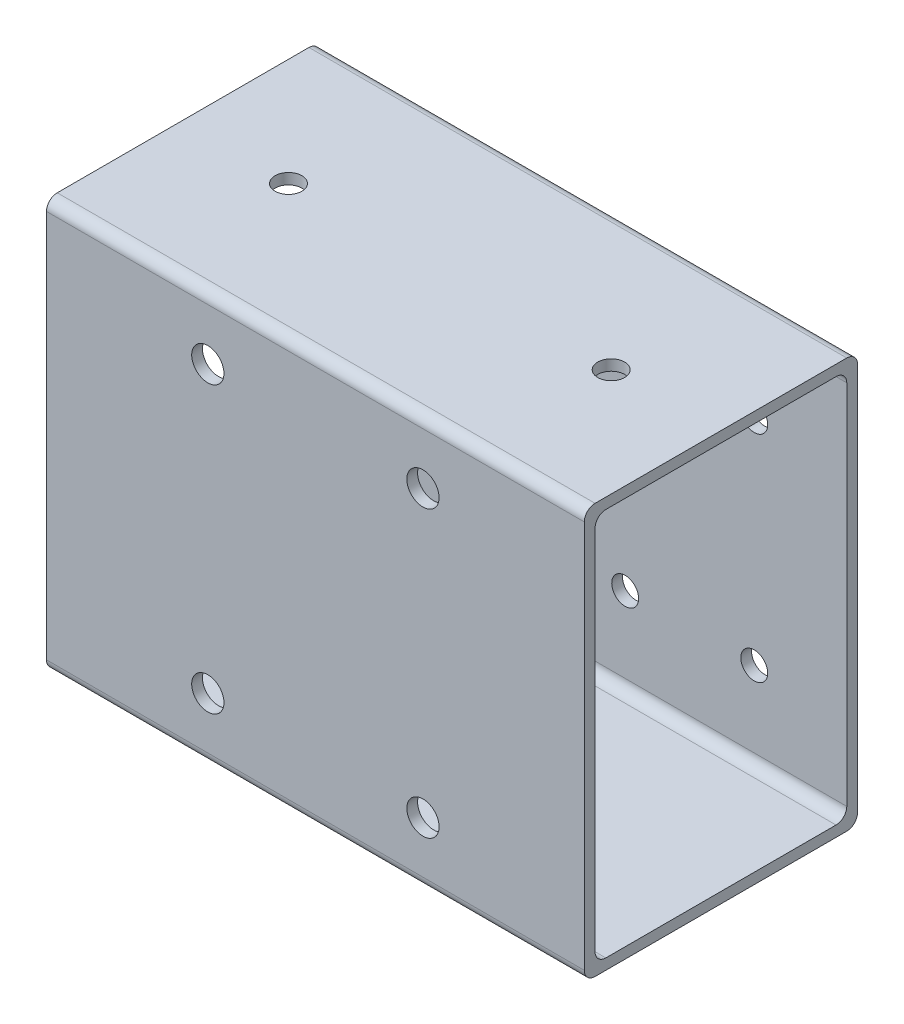
ISO-10303-21;
HEADER;
FILE_DESCRIPTION(('STEP AP214'),'2;1');
FILE_NAME('part.step','',(''),(''),'','','');
FILE_SCHEMA(('AUTOMOTIVE_DESIGN { 1 0 10303 214 1 1 1 1 }'));
ENDSEC;
DATA;
#1=APPLICATION_CONTEXT('core data for automotive mechanical design processes');
#2=APPLICATION_PROTOCOL_DEFINITION('international standard','automotive_design',2000,#1);
#3=PRODUCT_CONTEXT('',#1,'mechanical');
#4=PRODUCT('Part','Part','',(#3));
#5=PRODUCT_RELATED_PRODUCT_CATEGORY('part','',(#4));
#6=PRODUCT_DEFINITION_FORMATION('','',#4);
#7=PRODUCT_DEFINITION_CONTEXT('part definition',#1,'design');
#8=PRODUCT_DEFINITION('design','',#6,#7);
#9=PRODUCT_DEFINITION_SHAPE('','',#8);
#10=(LENGTH_UNIT() NAMED_UNIT(*) SI_UNIT(.MILLI.,.METRE.));
#11=(NAMED_UNIT(*) PLANE_ANGLE_UNIT() SI_UNIT($,.RADIAN.));
#12=(NAMED_UNIT(*) SI_UNIT($,.STERADIAN.) SOLID_ANGLE_UNIT());
#13=UNCERTAINTY_MEASURE_WITH_UNIT(LENGTH_MEASURE(1.E-05),#10,'distance_accuracy_value','');
#14=(GEOMETRIC_REPRESENTATION_CONTEXT(3) GLOBAL_UNCERTAINTY_ASSIGNED_CONTEXT((#13)) GLOBAL_UNIT_ASSIGNED_CONTEXT((#10,
#11,#12)) REPRESENTATION_CONTEXT('',''));
#15=CARTESIAN_POINT('',(0.,0.,0.));
#16=DIRECTION('',(0.,0.,1.));
#17=DIRECTION('',(1.,0.,0.));
#18=AXIS2_PLACEMENT_3D('',#15,#16,#17);
#19=CARTESIAN_POINT('',(-100.,38.1,25.4));
#20=DIRECTION('',(0.,0.,1.));
#21=DIRECTION('',(0.,-1.,0.));
#22=AXIS2_PLACEMENT_3D('',#19,#20,#21);
#23=PLANE('',#22);
#24=CARTESIAN_POINT('',(-30.,-26.5,25.4));
#25=DIRECTION('',(0.,0.,1.));
#26=DIRECTION('',(1.,0.,0.));
#27=AXIS2_PLACEMENT_3D('',#24,#25,#26);
#28=CIRCLE('',#27,3.);
#29=CARTESIAN_POINT('',(-27.,-26.5,25.4));
#30=VERTEX_POINT('',#29);
#31=EDGE_CURVE('E324',#30,#30,#28,.T.);
#32=ORIENTED_EDGE('',*,*,#31,.F.);
#33=EDGE_LOOP('',(#32));
#34=FACE_BOUND('',#33,.T.);
#35=CARTESIAN_POINT('',(-70.,-26.5,25.4));
#36=DIRECTION('',(0.,0.,1.));
#37=DIRECTION('',(1.,0.,0.));
#38=AXIS2_PLACEMENT_3D('',#35,#36,#37);
#39=CIRCLE('',#38,3.00000000000001);
#40=CARTESIAN_POINT('',(-67.,-26.5,25.4));
#41=VERTEX_POINT('',#40);
#42=EDGE_CURVE('E397',#41,#41,#39,.T.);
#43=ORIENTED_EDGE('',*,*,#42,.F.);
#44=EDGE_LOOP('',(#43));
#45=FACE_BOUND('',#44,.T.);
#46=CARTESIAN_POINT('',(-70.,26.5,25.4));
#47=DIRECTION('',(0.,0.,1.));
#48=DIRECTION('',(1.,0.,0.));
#49=AXIS2_PLACEMENT_3D('',#46,#47,#48);
#50=CIRCLE('',#49,3.00000000000001);
#51=CARTESIAN_POINT('',(-67.,26.5,25.4));
#52=VERTEX_POINT('',#51);
#53=EDGE_CURVE('E393',#52,#52,#50,.T.);
#54=ORIENTED_EDGE('',*,*,#53,.F.);
#55=EDGE_LOOP('',(#54));
#56=FACE_BOUND('',#55,.T.);
#57=CARTESIAN_POINT('',(-30.,26.5,25.4));
#58=DIRECTION('',(0.,0.,1.));
#59=DIRECTION('',(1.,0.,0.));
#60=AXIS2_PLACEMENT_3D('',#57,#58,#59);
#61=CIRCLE('',#60,3.);
#62=CARTESIAN_POINT('',(-27.,26.5,25.4));
#63=VERTEX_POINT('',#62);
#64=EDGE_CURVE('E290',#63,#63,#61,.T.);
#65=ORIENTED_EDGE('',*,*,#64,.F.);
#66=EDGE_LOOP('',(#65));
#67=FACE_BOUND('',#66,.T.);
#68=DIRECTION('',(0.,-1.,0.));
#69=VECTOR('',#68,1.);
#70=CARTESIAN_POINT('',(-100.,38.1,25.4));
#71=LINE('',#70,#69);
#72=CARTESIAN_POINT('',(-100.,36.1,25.4));
#73=VERTEX_POINT('',#72);
#74=CARTESIAN_POINT('',(-100.,-36.0999999999999,25.4));
#75=VERTEX_POINT('',#74);
#76=EDGE_CURVE('E438',#73,#75,#71,.T.);
#77=ORIENTED_EDGE('',*,*,#76,.T.);
#78=DIRECTION('',(1.,0.,0.));
#79=VECTOR('',#78,1.);
#80=CARTESIAN_POINT('',(-100.,-36.1,25.4));
#81=LINE('',#80,#79);
#82=CARTESIAN_POINT('',(0.,-36.0999999999999,25.4));
#83=VERTEX_POINT('',#82);
#84=EDGE_CURVE('E228',#75,#83,#81,.T.);
#85=ORIENTED_EDGE('',*,*,#84,.T.);
#86=DIRECTION('',(0.,-1.,0.));
#87=VECTOR('',#86,1.);
#88=CARTESIAN_POINT('',(0.,38.1,25.4));
#89=LINE('',#88,#87);
#90=CARTESIAN_POINT('',(0.,36.1,25.4));
#91=VERTEX_POINT('',#90);
#92=EDGE_CURVE('E166',#91,#83,#89,.T.);
#93=ORIENTED_EDGE('',*,*,#92,.F.);
#94=DIRECTION('',(1.,0.,0.));
#95=VECTOR('',#94,1.);
#96=CARTESIAN_POINT('',(-100.,36.1,25.4));
#97=LINE('',#96,#95);
#98=EDGE_CURVE('E225',#91,#73,#97,.F.);
#99=ORIENTED_EDGE('',*,*,#98,.T.);
#100=EDGE_LOOP('',(#77,#85,#93,#99));
#101=FACE_BOUND('',#100,.T.);
#102=ADVANCED_FACE('F44',(#34,#45,#56,#67,#101),#23,.T.);
#103=CARTESIAN_POINT('',(-100.,38.1,-25.4));
#104=DIRECTION('',(0.,1.,0.));
#105=DIRECTION('',(0.,0.,1.));
#106=AXIS2_PLACEMENT_3D('',#103,#104,#105);
#107=PLANE('',#106);
#108=CARTESIAN_POINT('',(-80.,38.1,0.400000000000013));
#109=DIRECTION('',(0.,1.,0.));
#110=DIRECTION('',(0.,0.,1.));
#111=AXIS2_PLACEMENT_3D('',#108,#109,#110);
#112=CIRCLE('',#111,2.50000000000001);
#113=CARTESIAN_POINT('',(-80.,38.1,2.90000000000002));
#114=VERTEX_POINT('',#113);
#115=EDGE_CURVE('E345',#114,#114,#112,.T.);
#116=ORIENTED_EDGE('',*,*,#115,.F.);
#117=EDGE_LOOP('',(#116));
#118=FACE_BOUND('',#117,.T.);
#119=CARTESIAN_POINT('',(-20.,38.1,0.400000000000013));
#120=DIRECTION('',(0.,1.,0.));
#121=DIRECTION('',(0.,0.,1.));
#122=AXIS2_PLACEMENT_3D('',#119,#120,#121);
#123=CIRCLE('',#122,2.5);
#124=CARTESIAN_POINT('',(-20.,38.1,2.90000000000001));
#125=VERTEX_POINT('',#124);
#126=EDGE_CURVE('E353',#125,#125,#123,.T.);
#127=ORIENTED_EDGE('',*,*,#126,.F.);
#128=EDGE_LOOP('',(#127));
#129=FACE_BOUND('',#128,.T.);
#130=DIRECTION('',(0.,0.,1.));
#131=VECTOR('',#130,1.);
#132=CARTESIAN_POINT('',(-100.,38.1,-25.4));
#133=LINE('',#132,#131);
#134=CARTESIAN_POINT('',(-100.,38.1,-23.4));
#135=VERTEX_POINT('',#134);
#136=CARTESIAN_POINT('',(-100.,38.1,23.4));
#137=VERTEX_POINT('',#136);
#138=EDGE_CURVE('E190',#135,#137,#133,.T.);
#139=ORIENTED_EDGE('',*,*,#138,.T.);
#140=DIRECTION('',(1.,0.,0.));
#141=VECTOR('',#140,1.);
#142=CARTESIAN_POINT('',(-100.,38.1,23.4));
#143=LINE('',#142,#141);
#144=CARTESIAN_POINT('',(0.,38.1,23.4));
#145=VERTEX_POINT('',#144);
#146=EDGE_CURVE('E233',#137,#145,#143,.T.);
#147=ORIENTED_EDGE('',*,*,#146,.T.);
#148=DIRECTION('',(0.,0.,1.));
#149=VECTOR('',#148,1.);
#150=CARTESIAN_POINT('',(0.,38.1,-25.4));
#151=LINE('',#150,#149);
#152=CARTESIAN_POINT('',(0.,38.1,-23.4));
#153=VERTEX_POINT('',#152);
#154=EDGE_CURVE('E199',#153,#145,#151,.T.);
#155=ORIENTED_EDGE('',*,*,#154,.F.);
#156=DIRECTION('',(1.,0.,0.));
#157=VECTOR('',#156,1.);
#158=CARTESIAN_POINT('',(-100.,38.1,-23.4));
#159=LINE('',#158,#157);
#160=EDGE_CURVE('E69',#153,#135,#159,.F.);
#161=ORIENTED_EDGE('',*,*,#160,.T.);
#162=EDGE_LOOP('',(#139,#147,#155,#161));
#163=FACE_BOUND('',#162,.T.);
#164=ADVANCED_FACE('F454',(#118,#129,#163),#107,.T.);
#165=CARTESIAN_POINT('',(-100.,38.1,-25.4));
#166=DIRECTION('',(0.,0.,-1.));
#167=DIRECTION('',(0.,1.,0.));
#168=AXIS2_PLACEMENT_3D('',#165,#166,#167);
#169=PLANE('',#168);
#170=CARTESIAN_POINT('',(-17.2,-20.,-25.4));
#171=DIRECTION('',(0.,0.,-1.));
#172=DIRECTION('',(0.,1.,0.));
#173=AXIS2_PLACEMENT_3D('',#170,#171,#172);
#174=CIRCLE('',#173,2.5);
#175=CARTESIAN_POINT('',(-17.2,-17.5,-25.4));
#176=VERTEX_POINT('',#175);
#177=EDGE_CURVE('E351',#176,#176,#174,.T.);
#178=ORIENTED_EDGE('',*,*,#177,.F.);
#179=EDGE_LOOP('',(#178));
#180=FACE_BOUND('',#179,.T.);
#181=CARTESIAN_POINT('',(-41.2,-20.,-25.4));
#182=DIRECTION('',(0.,0.,-1.));
#183=DIRECTION('',(0.,1.,0.));
#184=AXIS2_PLACEMENT_3D('',#181,#182,#183);
#185=CIRCLE('',#184,2.5);
#186=CARTESIAN_POINT('',(-41.2,-17.5,-25.4));
#187=VERTEX_POINT('',#186);
#188=EDGE_CURVE('E365',#187,#187,#185,.T.);
#189=ORIENTED_EDGE('',*,*,#188,.F.);
#190=EDGE_LOOP('',(#189));
#191=FACE_BOUND('',#190,.T.);
#192=CARTESIAN_POINT('',(-41.2,20.,-25.4));
#193=DIRECTION('',(0.,0.,-1.));
#194=DIRECTION('',(0.,1.,0.));
#195=AXIS2_PLACEMENT_3D('',#192,#193,#194);
#196=CIRCLE('',#195,2.5);
#197=CARTESIAN_POINT('',(-41.2,22.5,-25.4));
#198=VERTEX_POINT('',#197);
#199=EDGE_CURVE('E361',#198,#198,#196,.T.);
#200=ORIENTED_EDGE('',*,*,#199,.F.);
#201=EDGE_LOOP('',(#200));
#202=FACE_BOUND('',#201,.T.);
#203=CARTESIAN_POINT('',(-17.2,20.,-25.4));
#204=DIRECTION('',(0.,0.,-1.));
#205=DIRECTION('',(0.,1.,0.));
#206=AXIS2_PLACEMENT_3D('',#203,#204,#205);
#207=CIRCLE('',#206,2.5);
#208=CARTESIAN_POINT('',(-17.2,22.5,-25.4));
#209=VERTEX_POINT('',#208);
#210=EDGE_CURVE('E330',#209,#209,#207,.T.);
#211=ORIENTED_EDGE('',*,*,#210,.F.);
#212=EDGE_LOOP('',(#211));
#213=FACE_BOUND('',#212,.T.);
#214=CARTESIAN_POINT('',(-74.6,0.,-25.4));
#215=DIRECTION('',(0.,0.,-1.));
#216=DIRECTION('',(0.,1.,0.));
#217=AXIS2_PLACEMENT_3D('',#214,#215,#216);
#218=CIRCLE('',#217,2.5);
#219=CARTESIAN_POINT('',(-74.6,2.49999999999999,-25.4));
#220=VERTEX_POINT('',#219);
#221=EDGE_CURVE('E341',#220,#220,#218,.T.);
#222=ORIENTED_EDGE('',*,*,#221,.F.);
#223=EDGE_LOOP('',(#222));
#224=FACE_BOUND('',#223,.T.);
#225=CARTESIAN_POINT('',(-90.,-23.1,-25.4));
#226=DIRECTION('',(0.,0.,-1.));
#227=DIRECTION('',(0.,1.,0.));
#228=AXIS2_PLACEMENT_3D('',#225,#226,#227);
#229=CIRCLE('',#228,2.50000000000001);
#230=CARTESIAN_POINT('',(-90.,-20.6,-25.4));
#231=VERTEX_POINT('',#230);
#232=EDGE_CURVE('E383',#231,#231,#229,.T.);
#233=ORIENTED_EDGE('',*,*,#232,.F.);
#234=EDGE_LOOP('',(#233));
#235=FACE_BOUND('',#234,.T.);
#236=CARTESIAN_POINT('',(-59.2,-23.1,-25.4));
#237=DIRECTION('',(0.,0.,-1.));
#238=DIRECTION('',(0.,1.,0.));
#239=AXIS2_PLACEMENT_3D('',#236,#237,#238);
#240=CIRCLE('',#239,2.5);
#241=CARTESIAN_POINT('',(-59.2,-20.6,-25.4));
#242=VERTEX_POINT('',#241);
#243=EDGE_CURVE('E379',#242,#242,#240,.T.);
#244=ORIENTED_EDGE('',*,*,#243,.F.);
#245=EDGE_LOOP('',(#244));
#246=FACE_BOUND('',#245,.T.);
#247=CARTESIAN_POINT('',(-59.2,23.1,-25.4));
#248=DIRECTION('',(0.,0.,-1.));
#249=DIRECTION('',(0.,1.,0.));
#250=AXIS2_PLACEMENT_3D('',#247,#248,#249);
#251=CIRCLE('',#250,2.5);
#252=CARTESIAN_POINT('',(-59.2,25.6,-25.4));
#253=VERTEX_POINT('',#252);
#254=EDGE_CURVE('E375',#253,#253,#251,.T.);
#255=ORIENTED_EDGE('',*,*,#254,.F.);
#256=EDGE_LOOP('',(#255));
#257=FACE_BOUND('',#256,.T.);
#258=CARTESIAN_POINT('',(-90.,23.1,-25.4));
#259=DIRECTION('',(0.,0.,-1.));
#260=DIRECTION('',(0.,1.,0.));
#261=AXIS2_PLACEMENT_3D('',#258,#259,#260);
#262=CIRCLE('',#261,2.5);
#263=CARTESIAN_POINT('',(-90.,25.6,-25.4));
#264=VERTEX_POINT('',#263);
#265=EDGE_CURVE('E308',#264,#264,#262,.T.);
#266=ORIENTED_EDGE('',*,*,#265,.F.);
#267=EDGE_LOOP('',(#266));
#268=FACE_BOUND('',#267,.T.);
#269=DIRECTION('',(0.,1.,0.));
#270=VECTOR('',#269,1.);
#271=CARTESIAN_POINT('',(0.,38.1,-25.4));
#272=LINE('',#271,#270);
#273=CARTESIAN_POINT('',(0.,-36.0999999999999,-25.4));
#274=VERTEX_POINT('',#273);
#275=CARTESIAN_POINT('',(0.,36.1,-25.4));
#276=VERTEX_POINT('',#275);
#277=EDGE_CURVE('E184',#274,#276,#272,.T.);
#278=ORIENTED_EDGE('',*,*,#277,.F.);
#279=DIRECTION('',(1.,0.,0.));
#280=VECTOR('',#279,1.);
#281=CARTESIAN_POINT('',(-100.,-36.1,-25.4));
#282=LINE('',#281,#280);
#283=CARTESIAN_POINT('',(-100.,-36.0999999999999,-25.4));
#284=VERTEX_POINT('',#283);
#285=EDGE_CURVE('E212',#274,#284,#282,.F.);
#286=ORIENTED_EDGE('',*,*,#285,.T.);
#287=DIRECTION('',(0.,1.,0.));
#288=VECTOR('',#287,1.);
#289=CARTESIAN_POINT('',(-100.,38.1,-25.4));
#290=LINE('',#289,#288);
#291=CARTESIAN_POINT('',(-100.,36.1,-25.4));
#292=VERTEX_POINT('',#291);
#293=EDGE_CURVE('E196',#284,#292,#290,.T.);
#294=ORIENTED_EDGE('',*,*,#293,.T.);
#295=DIRECTION('',(1.,0.,0.));
#296=VECTOR('',#295,1.);
#297=CARTESIAN_POINT('',(-100.,36.1,-25.4));
#298=LINE('',#297,#296);
#299=EDGE_CURVE('E208',#292,#276,#298,.T.);
#300=ORIENTED_EDGE('',*,*,#299,.T.);
#301=EDGE_LOOP('',(#278,#286,#294,#300));
#302=FACE_BOUND('',#301,.T.);
#303=ADVANCED_FACE('F464',(#180,#191,#202,#213,#224,#235,#246,#257,#268,#302),#169,.T.);
#304=CARTESIAN_POINT('',(-100.,-38.1,-25.4));
#305=DIRECTION('',(0.,-1.,0.));
#306=DIRECTION('',(0.,0.,-1.));
#307=AXIS2_PLACEMENT_3D('',#304,#305,#306);
#308=PLANE('',#307);
#309=DIRECTION('',(0.,0.,-1.));
#310=VECTOR('',#309,1.);
#311=CARTESIAN_POINT('',(-100.,-38.1,-25.4));
#312=LINE('',#311,#310);
#313=CARTESIAN_POINT('',(-100.,-38.1,23.4));
#314=VERTEX_POINT('',#313);
#315=CARTESIAN_POINT('',(-100.,-38.1,-23.4));
#316=VERTEX_POINT('',#315);
#317=EDGE_CURVE('E442',#314,#316,#312,.T.);
#318=ORIENTED_EDGE('',*,*,#317,.T.);
#319=DIRECTION('',(1.,0.,0.));
#320=VECTOR('',#319,1.);
#321=CARTESIAN_POINT('',(-100.,-38.1,-23.4));
#322=LINE('',#321,#320);
#323=CARTESIAN_POINT('',(0.,-38.1,-23.4));
#324=VERTEX_POINT('',#323);
#325=EDGE_CURVE('E182',#316,#324,#322,.T.);
#326=ORIENTED_EDGE('',*,*,#325,.T.);
#327=DIRECTION('',(0.,0.,-1.));
#328=VECTOR('',#327,1.);
#329=CARTESIAN_POINT('',(0.,-38.1,-25.4));
#330=LINE('',#329,#328);
#331=CARTESIAN_POINT('',(0.,-38.1,23.4));
#332=VERTEX_POINT('',#331);
#333=EDGE_CURVE('E164',#332,#324,#330,.T.);
#334=ORIENTED_EDGE('',*,*,#333,.F.);
#335=DIRECTION('',(1.,0.,0.));
#336=VECTOR('',#335,1.);
#337=CARTESIAN_POINT('',(-100.,-38.1,23.4));
#338=LINE('',#337,#336);
#339=EDGE_CURVE('E179',#332,#314,#338,.F.);
#340=ORIENTED_EDGE('',*,*,#339,.T.);
#341=EDGE_LOOP('',(#318,#326,#334,#340));
#342=FACE_BOUND('',#341,.T.);
#343=ADVANCED_FACE('F178',(#342),#308,.T.);
#344=CARTESIAN_POINT('',(-100.,0.,0.));
#345=DIRECTION('',(-1.,0.,0.));
#346=DIRECTION('',(0.,0.,1.));
#347=AXIS2_PLACEMENT_3D('',#344,#345,#346);
#348=PLANE('',#347);
#349=DIRECTION('',(0.,0.,1.));
#350=VECTOR('',#349,1.);
#351=CARTESIAN_POINT('',(-100.,36.1,-23.4));
#352=LINE('',#351,#350);
#353=CARTESIAN_POINT('',(-100.,36.1,-21.4));
#354=VERTEX_POINT('',#353);
#355=CARTESIAN_POINT('',(-100.,36.1,21.4));
#356=VERTEX_POINT('',#355);
#357=EDGE_CURVE('E420',#354,#356,#352,.T.);
#358=ORIENTED_EDGE('',*,*,#357,.T.);
#359=CARTESIAN_POINT('',(-100.,34.1,21.4));
#360=DIRECTION('',(-1.,0.,0.));
#361=DIRECTION('',(0.,0.,1.));
#362=AXIS2_PLACEMENT_3D('',#359,#360,#361);
#363=CIRCLE('',#362,2.);
#364=CARTESIAN_POINT('',(-100.,34.1,23.4));
#365=VERTEX_POINT('',#364);
#366=EDGE_CURVE('E11',#356,#365,#363,.F.);
#367=ORIENTED_EDGE('',*,*,#366,.T.);
#368=DIRECTION('',(0.,-1.,0.));
#369=VECTOR('',#368,1.);
#370=CARTESIAN_POINT('',(-100.,36.1,23.4));
#371=LINE('',#370,#369);
#372=CARTESIAN_POINT('',(-100.,-34.1,23.4));
#373=VERTEX_POINT('',#372);
#374=EDGE_CURVE('E407',#365,#373,#371,.T.);
#375=ORIENTED_EDGE('',*,*,#374,.T.);
#376=CARTESIAN_POINT('',(-100.,-34.1,21.4));
#377=DIRECTION('',(-1.,0.,0.));
#378=DIRECTION('',(0.,0.,1.));
#379=AXIS2_PLACEMENT_3D('',#376,#377,#378);
#380=CIRCLE('',#379,2.);
#381=CARTESIAN_POINT('',(-100.,-36.1,21.4));
#382=VERTEX_POINT('',#381);
#383=EDGE_CURVE('E280',#373,#382,#380,.F.);
#384=ORIENTED_EDGE('',*,*,#383,.T.);
#385=DIRECTION('',(0.,0.,-1.));
#386=VECTOR('',#385,1.);
#387=CARTESIAN_POINT('',(-100.,-36.1,-23.4));
#388=LINE('',#387,#386);
#389=CARTESIAN_POINT('',(-100.,-36.1,-21.4));
#390=VERTEX_POINT('',#389);
#391=EDGE_CURVE('E411',#382,#390,#388,.T.);
#392=ORIENTED_EDGE('',*,*,#391,.T.);
#393=CARTESIAN_POINT('',(-100.,-34.1,-21.4));
#394=DIRECTION('',(-1.,0.,0.));
#395=DIRECTION('',(0.,0.,1.));
#396=AXIS2_PLACEMENT_3D('',#393,#394,#395);
#397=CIRCLE('',#396,2.);
#398=CARTESIAN_POINT('',(-100.,-34.1,-23.4));
#399=VERTEX_POINT('',#398);
#400=EDGE_CURVE('E268',#390,#399,#397,.F.);
#401=ORIENTED_EDGE('',*,*,#400,.T.);
#402=DIRECTION('',(0.,1.,0.));
#403=VECTOR('',#402,1.);
#404=CARTESIAN_POINT('',(-100.,36.1,-23.4));
#405=LINE('',#404,#403);
#406=CARTESIAN_POINT('',(-100.,34.1,-23.4));
#407=VERTEX_POINT('',#406);
#408=EDGE_CURVE('E416',#399,#407,#405,.T.);
#409=ORIENTED_EDGE('',*,*,#408,.T.);
#410=CARTESIAN_POINT('',(-100.,34.1,-21.4));
#411=DIRECTION('',(-1.,0.,0.));
#412=DIRECTION('',(0.,0.,1.));
#413=AXIS2_PLACEMENT_3D('',#410,#411,#412);
#414=CIRCLE('',#413,2.);
#415=EDGE_CURVE('E274',#407,#354,#414,.F.);
#416=ORIENTED_EDGE('',*,*,#415,.T.);
#417=EDGE_LOOP('',(#358,#367,#375,#384,#392,#401,#409,#416));
#418=FACE_BOUND('',#417,.T.);
#419=ORIENTED_EDGE('',*,*,#293,.F.);
#420=CARTESIAN_POINT('',(-100.,-36.1,-23.4));
#421=DIRECTION('',(-1.,0.,0.));
#422=DIRECTION('',(0.,0.,1.));
#423=AXIS2_PLACEMENT_3D('',#420,#421,#422);
#424=CIRCLE('',#423,2.);
#425=EDGE_CURVE('E222',#284,#316,#424,.T.);
#426=ORIENTED_EDGE('',*,*,#425,.T.);
#427=ORIENTED_EDGE('',*,*,#317,.F.);
#428=CARTESIAN_POINT('',(-100.,-36.1,23.4));
#429=DIRECTION('',(-1.,0.,0.));
#430=DIRECTION('',(0.,0.,1.));
#431=AXIS2_PLACEMENT_3D('',#428,#429,#430);
#432=CIRCLE('',#431,2.);
#433=EDGE_CURVE('E188',#314,#75,#432,.T.);
#434=ORIENTED_EDGE('',*,*,#433,.T.);
#435=ORIENTED_EDGE('',*,*,#76,.F.);
#436=CARTESIAN_POINT('',(-100.,36.1,23.4));
#437=DIRECTION('',(-1.,0.,0.));
#438=DIRECTION('',(0.,0.,1.));
#439=AXIS2_PLACEMENT_3D('',#436,#437,#438);
#440=CIRCLE('',#439,2.);
#441=EDGE_CURVE('E62',#73,#137,#440,.T.);
#442=ORIENTED_EDGE('',*,*,#441,.T.);
#443=ORIENTED_EDGE('',*,*,#138,.F.);
#444=CARTESIAN_POINT('',(-100.,36.1,-23.4));
#445=DIRECTION('',(-1.,0.,0.));
#446=DIRECTION('',(0.,0.,1.));
#447=AXIS2_PLACEMENT_3D('',#444,#445,#446);
#448=CIRCLE('',#447,2.);
#449=EDGE_CURVE('E215',#135,#292,#448,.T.);
#450=ORIENTED_EDGE('',*,*,#449,.T.);
#451=EDGE_LOOP('',(#419,#426,#427,#434,#435,#442,#443,#450));
#452=FACE_BOUND('',#451,.T.);
#453=ADVANCED_FACE('F461',(#418,#452),#348,.T.);
#454=CARTESIAN_POINT('',(0.,0.,0.));
#455=DIRECTION('',(-1.,0.,0.));
#456=DIRECTION('',(0.,0.,1.));
#457=AXIS2_PLACEMENT_3D('',#454,#455,#456);
#458=PLANE('',#457);
#459=DIRECTION('',(0.,0.,-1.));
#460=VECTOR('',#459,1.);
#461=CARTESIAN_POINT('',(0.,-36.1,-23.4));
#462=LINE('',#461,#460);
#463=CARTESIAN_POINT('',(0.,-36.1,21.4));
#464=VERTEX_POINT('',#463);
#465=CARTESIAN_POINT('',(0.,-36.1,-21.4));
#466=VERTEX_POINT('',#465);
#467=EDGE_CURVE('E427',#464,#466,#462,.T.);
#468=ORIENTED_EDGE('',*,*,#467,.F.);
#469=CARTESIAN_POINT('',(0.,-34.1,21.4));
#470=DIRECTION('',(-1.,0.,0.));
#471=DIRECTION('',(0.,0.,1.));
#472=AXIS2_PLACEMENT_3D('',#469,#470,#471);
#473=CIRCLE('',#472,2.);
#474=CARTESIAN_POINT('',(0.,-34.1,23.4));
#475=VERTEX_POINT('',#474);
#476=EDGE_CURVE('E277',#464,#475,#473,.T.);
#477=ORIENTED_EDGE('',*,*,#476,.T.);
#478=DIRECTION('',(0.,-1.,0.));
#479=VECTOR('',#478,1.);
#480=CARTESIAN_POINT('',(0.,36.1,23.4));
#481=LINE('',#480,#479);
#482=CARTESIAN_POINT('',(0.,34.1,23.4));
#483=VERTEX_POINT('',#482);
#484=EDGE_CURVE('E302',#483,#475,#481,.T.);
#485=ORIENTED_EDGE('',*,*,#484,.F.);
#486=CARTESIAN_POINT('',(0.,34.1,21.4));
#487=DIRECTION('',(-1.,0.,0.));
#488=DIRECTION('',(0.,0.,1.));
#489=AXIS2_PLACEMENT_3D('',#486,#487,#488);
#490=CIRCLE('',#489,2.);
#491=CARTESIAN_POINT('',(0.,36.1,21.4));
#492=VERTEX_POINT('',#491);
#493=EDGE_CURVE('E54',#483,#492,#490,.T.);
#494=ORIENTED_EDGE('',*,*,#493,.T.);
#495=DIRECTION('',(0.,0.,1.));
#496=VECTOR('',#495,1.);
#497=CARTESIAN_POINT('',(0.,36.1,-23.4));
#498=LINE('',#497,#496);
#499=CARTESIAN_POINT('',(0.,36.1,-21.4));
#500=VERTEX_POINT('',#499);
#501=EDGE_CURVE('E412',#500,#492,#498,.T.);
#502=ORIENTED_EDGE('',*,*,#501,.F.);
#503=CARTESIAN_POINT('',(0.,34.1,-21.4));
#504=DIRECTION('',(-1.,0.,0.));
#505=DIRECTION('',(0.,0.,1.));
#506=AXIS2_PLACEMENT_3D('',#503,#504,#505);
#507=CIRCLE('',#506,2.);
#508=CARTESIAN_POINT('',(0.,34.1,-23.4));
#509=VERTEX_POINT('',#508);
#510=EDGE_CURVE('E271',#500,#509,#507,.T.);
#511=ORIENTED_EDGE('',*,*,#510,.T.);
#512=DIRECTION('',(0.,1.,0.));
#513=VECTOR('',#512,1.);
#514=CARTESIAN_POINT('',(0.,36.1,-23.4));
#515=LINE('',#514,#513);
#516=CARTESIAN_POINT('',(0.,-34.1,-23.4));
#517=VERTEX_POINT('',#516);
#518=EDGE_CURVE('E431',#517,#509,#515,.T.);
#519=ORIENTED_EDGE('',*,*,#518,.F.);
#520=CARTESIAN_POINT('',(0.,-34.1,-21.4));
#521=DIRECTION('',(-1.,0.,0.));
#522=DIRECTION('',(0.,0.,1.));
#523=AXIS2_PLACEMENT_3D('',#520,#521,#522);
#524=CIRCLE('',#523,2.);
#525=EDGE_CURVE('E265',#517,#466,#524,.T.);
#526=ORIENTED_EDGE('',*,*,#525,.T.);
#527=EDGE_LOOP('',(#468,#477,#485,#494,#502,#511,#519,#526));
#528=FACE_BOUND('',#527,.T.);
#529=ORIENTED_EDGE('',*,*,#333,.T.);
#530=CARTESIAN_POINT('',(0.,-36.1,-23.4));
#531=DIRECTION('',(-1.,0.,0.));
#532=DIRECTION('',(0.,0.,1.));
#533=AXIS2_PLACEMENT_3D('',#530,#531,#532);
#534=CIRCLE('',#533,2.);
#535=EDGE_CURVE('E172',#324,#274,#534,.F.);
#536=ORIENTED_EDGE('',*,*,#535,.T.);
#537=ORIENTED_EDGE('',*,*,#277,.T.);
#538=CARTESIAN_POINT('',(0.,36.1,-23.4));
#539=DIRECTION('',(-1.,0.,0.));
#540=DIRECTION('',(0.,0.,1.));
#541=AXIS2_PLACEMENT_3D('',#538,#539,#540);
#542=CIRCLE('',#541,2.);
#543=EDGE_CURVE('E194',#276,#153,#542,.F.);
#544=ORIENTED_EDGE('',*,*,#543,.T.);
#545=ORIENTED_EDGE('',*,*,#154,.T.);
#546=CARTESIAN_POINT('',(0.,36.1,23.4));
#547=DIRECTION('',(-1.,0.,0.));
#548=DIRECTION('',(0.,0.,1.));
#549=AXIS2_PLACEMENT_3D('',#546,#547,#548);
#550=CIRCLE('',#549,2.);
#551=EDGE_CURVE('E173',#145,#91,#550,.F.);
#552=ORIENTED_EDGE('',*,*,#551,.T.);
#553=ORIENTED_EDGE('',*,*,#92,.T.);
#554=CARTESIAN_POINT('',(0.,-36.1,23.4));
#555=DIRECTION('',(-1.,0.,0.));
#556=DIRECTION('',(0.,0.,1.));
#557=AXIS2_PLACEMENT_3D('',#554,#555,#556);
#558=CIRCLE('',#557,2.);
#559=EDGE_CURVE('E161',#83,#332,#558,.F.);
#560=ORIENTED_EDGE('',*,*,#559,.T.);
#561=EDGE_LOOP('',(#529,#536,#537,#544,#545,#552,#553,#560));
#562=FACE_BOUND('',#561,.T.);
#563=ADVANCED_FACE('F163',(#528,#562),#458,.F.);
#564=CARTESIAN_POINT('',(-100.,36.1,23.4));
#565=DIRECTION('',(0.,0.,1.));
#566=DIRECTION('',(1.,0.,0.));
#567=AXIS2_PLACEMENT_3D('',#564,#565,#566);
#568=PLANE('',#567);
#569=CARTESIAN_POINT('',(-30.,-26.5,23.4));
#570=DIRECTION('',(0.,0.,1.));
#571=DIRECTION('',(1.,0.,0.));
#572=AXIS2_PLACEMENT_3D('',#569,#570,#571);
#573=CIRCLE('',#572,3.);
#574=CARTESIAN_POINT('',(-27.,-26.5,23.4));
#575=VERTEX_POINT('',#574);
#576=EDGE_CURVE('E298',#575,#575,#573,.T.);
#577=ORIENTED_EDGE('',*,*,#576,.T.);
#578=EDGE_LOOP('',(#577));
#579=FACE_BOUND('',#578,.T.);
#580=CARTESIAN_POINT('',(-70.,-26.5,23.4));
#581=DIRECTION('',(0.,0.,1.));
#582=DIRECTION('',(1.,0.,0.));
#583=AXIS2_PLACEMENT_3D('',#580,#581,#582);
#584=CIRCLE('',#583,3.00000000000001);
#585=CARTESIAN_POINT('',(-67.,-26.5,23.4));
#586=VERTEX_POINT('',#585);
#587=EDGE_CURVE('E294',#586,#586,#584,.T.);
#588=ORIENTED_EDGE('',*,*,#587,.T.);
#589=EDGE_LOOP('',(#588));
#590=FACE_BOUND('',#589,.T.);
#591=CARTESIAN_POINT('',(-70.,26.5,23.4));
#592=DIRECTION('',(0.,0.,1.));
#593=DIRECTION('',(1.,0.,0.));
#594=AXIS2_PLACEMENT_3D('',#591,#592,#593);
#595=CIRCLE('',#594,3.00000000000001);
#596=CARTESIAN_POINT('',(-67.,26.5,23.4));
#597=VERTEX_POINT('',#596);
#598=EDGE_CURVE('E289',#597,#597,#595,.T.);
#599=ORIENTED_EDGE('',*,*,#598,.T.);
#600=EDGE_LOOP('',(#599));
#601=FACE_BOUND('',#600,.T.);
#602=CARTESIAN_POINT('',(-30.,26.5,23.4));
#603=DIRECTION('',(0.,0.,1.));
#604=DIRECTION('',(1.,0.,0.));
#605=AXIS2_PLACEMENT_3D('',#602,#603,#604);
#606=CIRCLE('',#605,3.);
#607=CARTESIAN_POINT('',(-27.,26.5,23.4));
#608=VERTEX_POINT('',#607);
#609=EDGE_CURVE('E285',#608,#608,#606,.T.);
#610=ORIENTED_EDGE('',*,*,#609,.T.);
#611=EDGE_LOOP('',(#610));
#612=FACE_BOUND('',#611,.T.);
#613=ORIENTED_EDGE('',*,*,#484,.T.);
#614=DIRECTION('',(1.,0.,0.));
#615=VECTOR('',#614,1.);
#616=CARTESIAN_POINT('',(-100.,-34.1,23.4));
#617=LINE('',#616,#615);
#618=EDGE_CURVE('E262',#475,#373,#617,.F.);
#619=ORIENTED_EDGE('',*,*,#618,.T.);
#620=ORIENTED_EDGE('',*,*,#374,.F.);
#621=DIRECTION('',(1.,0.,0.));
#622=VECTOR('',#621,1.);
#623=CARTESIAN_POINT('',(0.,34.1,23.4));
#624=LINE('',#623,#622);
#625=EDGE_CURVE('E258',#365,#483,#624,.T.);
#626=ORIENTED_EDGE('',*,*,#625,.T.);
#627=EDGE_LOOP('',(#613,#619,#620,#626));
#628=FACE_BOUND('',#627,.T.);
#629=ADVANCED_FACE('F510',(#579,#590,#601,#612,#628),#568,.F.);
#630=CARTESIAN_POINT('',(-100.,36.1,-23.4));
#631=DIRECTION('',(0.,1.,0.));
#632=DIRECTION('',(0.,0.,1.));
#633=AXIS2_PLACEMENT_3D('',#630,#631,#632);
#634=PLANE('',#633);
#635=CARTESIAN_POINT('',(-80.,36.1,0.400000000000013));
#636=DIRECTION('',(0.,1.,0.));
#637=DIRECTION('',(0.,0.,1.));
#638=AXIS2_PLACEMENT_3D('',#635,#636,#637);
#639=CIRCLE('',#638,2.50000000000001);
#640=CARTESIAN_POINT('',(-80.,36.1,2.90000000000002));
#641=VERTEX_POINT('',#640);
#642=EDGE_CURVE('E48',#641,#641,#639,.T.);
#643=ORIENTED_EDGE('',*,*,#642,.T.);
#644=EDGE_LOOP('',(#643));
#645=FACE_BOUND('',#644,.T.);
#646=CARTESIAN_POINT('',(-20.,36.1,0.400000000000013));
#647=DIRECTION('',(0.,1.,0.));
#648=DIRECTION('',(0.,0.,1.));
#649=AXIS2_PLACEMENT_3D('',#646,#647,#648);
#650=CIRCLE('',#649,2.5);
#651=CARTESIAN_POINT('',(-20.,36.1,2.90000000000001));
#652=VERTEX_POINT('',#651);
#653=EDGE_CURVE('E342',#652,#652,#650,.T.);
#654=ORIENTED_EDGE('',*,*,#653,.T.);
#655=EDGE_LOOP('',(#654));
#656=FACE_BOUND('',#655,.T.);
#657=ORIENTED_EDGE('',*,*,#357,.F.);
#658=DIRECTION('',(1.,0.,0.));
#659=VECTOR('',#658,1.);
#660=CARTESIAN_POINT('',(0.,36.1,-21.4));
#661=LINE('',#660,#659);
#662=EDGE_CURVE('E254',#354,#500,#661,.T.);
#663=ORIENTED_EDGE('',*,*,#662,.T.);
#664=ORIENTED_EDGE('',*,*,#501,.T.);
#665=DIRECTION('',(1.,0.,0.));
#666=VECTOR('',#665,1.);
#667=CARTESIAN_POINT('',(-100.,36.1,21.4));
#668=LINE('',#667,#666);
#669=EDGE_CURVE('E251',#492,#356,#668,.F.);
#670=ORIENTED_EDGE('',*,*,#669,.T.);
#671=EDGE_LOOP('',(#657,#663,#664,#670));
#672=FACE_BOUND('',#671,.T.);
#673=ADVANCED_FACE('F505',(#645,#656,#672),#634,.F.);
#674=CARTESIAN_POINT('',(-100.,36.1,-23.4));
#675=DIRECTION('',(0.,0.,-1.));
#676=DIRECTION('',(-1.,0.,0.));
#677=AXIS2_PLACEMENT_3D('',#674,#675,#676);
#678=PLANE('',#677);
#679=CARTESIAN_POINT('',(-17.2,-20.,-23.4));
#680=DIRECTION('',(0.,0.,-1.));
#681=DIRECTION('',(-1.,0.,0.));
#682=AXIS2_PLACEMENT_3D('',#679,#680,#681);
#683=CIRCLE('',#682,2.5);
#684=CARTESIAN_POINT('',(-19.7,-20.,-23.4));
#685=VERTEX_POINT('',#684);
#686=EDGE_CURVE('E338',#685,#685,#683,.T.);
#687=ORIENTED_EDGE('',*,*,#686,.T.);
#688=EDGE_LOOP('',(#687));
#689=FACE_BOUND('',#688,.T.);
#690=CARTESIAN_POINT('',(-41.2,-20.,-23.4));
#691=DIRECTION('',(0.,0.,-1.));
#692=DIRECTION('',(-1.,0.,0.));
#693=AXIS2_PLACEMENT_3D('',#690,#691,#692);
#694=CIRCLE('',#693,2.5);
#695=CARTESIAN_POINT('',(-43.7,-20.,-23.4));
#696=VERTEX_POINT('',#695);
#697=EDGE_CURVE('E334',#696,#696,#694,.T.);
#698=ORIENTED_EDGE('',*,*,#697,.T.);
#699=EDGE_LOOP('',(#698));
#700=FACE_BOUND('',#699,.T.);
#701=CARTESIAN_POINT('',(-41.2,20.,-23.4));
#702=DIRECTION('',(0.,0.,-1.));
#703=DIRECTION('',(-1.,0.,0.));
#704=AXIS2_PLACEMENT_3D('',#701,#702,#703);
#705=CIRCLE('',#704,2.5);
#706=CARTESIAN_POINT('',(-43.7,20.,-23.4));
#707=VERTEX_POINT('',#706);
#708=EDGE_CURVE('E329',#707,#707,#705,.T.);
#709=ORIENTED_EDGE('',*,*,#708,.T.);
#710=EDGE_LOOP('',(#709));
#711=FACE_BOUND('',#710,.T.);
#712=CARTESIAN_POINT('',(-17.2,20.,-23.4));
#713=DIRECTION('',(0.,0.,-1.));
#714=DIRECTION('',(-1.,0.,0.));
#715=AXIS2_PLACEMENT_3D('',#712,#713,#714);
#716=CIRCLE('',#715,2.5);
#717=CARTESIAN_POINT('',(-19.7,20.,-23.4));
#718=VERTEX_POINT('',#717);
#719=EDGE_CURVE('E325',#718,#718,#716,.T.);
#720=ORIENTED_EDGE('',*,*,#719,.T.);
#721=EDGE_LOOP('',(#720));
#722=FACE_BOUND('',#721,.T.);
#723=CARTESIAN_POINT('',(-74.6,0.,-23.4));
#724=DIRECTION('',(0.,0.,-1.));
#725=DIRECTION('',(-1.,0.,0.));
#726=AXIS2_PLACEMENT_3D('',#723,#724,#725);
#727=CIRCLE('',#726,2.5);
#728=CARTESIAN_POINT('',(-77.1,0.,-23.4));
#729=VERTEX_POINT('',#728);
#730=EDGE_CURVE('E320',#729,#729,#727,.T.);
#731=ORIENTED_EDGE('',*,*,#730,.T.);
#732=EDGE_LOOP('',(#731));
#733=FACE_BOUND('',#732,.T.);
#734=CARTESIAN_POINT('',(-90.,-23.1,-23.4));
#735=DIRECTION('',(0.,0.,-1.));
#736=DIRECTION('',(-1.,0.,0.));
#737=AXIS2_PLACEMENT_3D('',#734,#735,#736);
#738=CIRCLE('',#737,2.50000000000001);
#739=CARTESIAN_POINT('',(-92.5,-23.1,-23.4));
#740=VERTEX_POINT('',#739);
#741=EDGE_CURVE('E316',#740,#740,#738,.T.);
#742=ORIENTED_EDGE('',*,*,#741,.T.);
#743=EDGE_LOOP('',(#742));
#744=FACE_BOUND('',#743,.T.);
#745=CARTESIAN_POINT('',(-59.2,-23.1,-23.4));
#746=DIRECTION('',(0.,0.,-1.));
#747=DIRECTION('',(-1.,0.,0.));
#748=AXIS2_PLACEMENT_3D('',#745,#746,#747);
#749=CIRCLE('',#748,2.5);
#750=CARTESIAN_POINT('',(-61.7,-23.1,-23.4));
#751=VERTEX_POINT('',#750);
#752=EDGE_CURVE('E312',#751,#751,#749,.T.);
#753=ORIENTED_EDGE('',*,*,#752,.T.);
#754=EDGE_LOOP('',(#753));
#755=FACE_BOUND('',#754,.T.);
#756=CARTESIAN_POINT('',(-59.2,23.1,-23.4));
#757=DIRECTION('',(0.,0.,-1.));
#758=DIRECTION('',(-1.,0.,0.));
#759=AXIS2_PLACEMENT_3D('',#756,#757,#758);
#760=CIRCLE('',#759,2.5);
#761=CARTESIAN_POINT('',(-61.7,23.1,-23.4));
#762=VERTEX_POINT('',#761);
#763=EDGE_CURVE('E307',#762,#762,#760,.T.);
#764=ORIENTED_EDGE('',*,*,#763,.T.);
#765=EDGE_LOOP('',(#764));
#766=FACE_BOUND('',#765,.T.);
#767=CARTESIAN_POINT('',(-90.,23.1,-23.4));
#768=DIRECTION('',(0.,0.,-1.));
#769=DIRECTION('',(-1.,0.,0.));
#770=AXIS2_PLACEMENT_3D('',#767,#768,#769);
#771=CIRCLE('',#770,2.5);
#772=CARTESIAN_POINT('',(-92.5,23.1,-23.4));
#773=VERTEX_POINT('',#772);
#774=EDGE_CURVE('E303',#773,#773,#771,.T.);
#775=ORIENTED_EDGE('',*,*,#774,.T.);
#776=EDGE_LOOP('',(#775));
#777=FACE_BOUND('',#776,.T.);
#778=ORIENTED_EDGE('',*,*,#408,.F.);
#779=DIRECTION('',(1.,0.,0.));
#780=VECTOR('',#779,1.);
#781=CARTESIAN_POINT('',(0.,-34.1,-23.4));
#782=LINE('',#781,#780);
#783=EDGE_CURVE('E240',#399,#517,#782,.T.);
#784=ORIENTED_EDGE('',*,*,#783,.T.);
#785=ORIENTED_EDGE('',*,*,#518,.T.);
#786=DIRECTION('',(1.,0.,0.));
#787=VECTOR('',#786,1.);
#788=CARTESIAN_POINT('',(-100.,34.1,-23.4));
#789=LINE('',#788,#787);
#790=EDGE_CURVE('E237',#509,#407,#789,.F.);
#791=ORIENTED_EDGE('',*,*,#790,.T.);
#792=EDGE_LOOP('',(#778,#784,#785,#791));
#793=FACE_BOUND('',#792,.T.);
#794=ADVANCED_FACE('F499',(#689,#700,#711,#722,#733,#744,#755,#766,#777,#793),#678,.F.);
#795=CARTESIAN_POINT('',(-100.,-36.1,-23.4));
#796=DIRECTION('',(0.,-1.,0.));
#797=DIRECTION('',(0.,0.,-1.));
#798=AXIS2_PLACEMENT_3D('',#795,#796,#797);
#799=PLANE('',#798);
#800=ORIENTED_EDGE('',*,*,#467,.T.);
#801=DIRECTION('',(1.,0.,0.));
#802=VECTOR('',#801,1.);
#803=CARTESIAN_POINT('',(-100.,-36.1,-21.4));
#804=LINE('',#803,#802);
#805=EDGE_CURVE('E248',#466,#390,#804,.F.);
#806=ORIENTED_EDGE('',*,*,#805,.T.);
#807=ORIENTED_EDGE('',*,*,#391,.F.);
#808=DIRECTION('',(1.,0.,0.));
#809=VECTOR('',#808,1.);
#810=CARTESIAN_POINT('',(0.,-36.1,21.4));
#811=LINE('',#810,#809);
#812=EDGE_CURVE('E244',#382,#464,#811,.T.);
#813=ORIENTED_EDGE('',*,*,#812,.T.);
#814=EDGE_LOOP('',(#800,#806,#807,#813));
#815=FACE_BOUND('',#814,.T.);
#816=ADVANCED_FACE('F495',(#815),#799,.F.);
#817=CARTESIAN_POINT('',(-100.,-36.1,-23.4));
#818=DIRECTION('',(1.,0.,0.));
#819=DIRECTION('',(0.,0.,-1.));
#820=AXIS2_PLACEMENT_3D('',#817,#818,#819);
#821=CYLINDRICAL_SURFACE('',#820,2.);
#822=ORIENTED_EDGE('',*,*,#425,.F.);
#823=ORIENTED_EDGE('',*,*,#285,.F.);
#824=ORIENTED_EDGE('',*,*,#535,.F.);
#825=ORIENTED_EDGE('',*,*,#325,.F.);
#826=EDGE_LOOP('',(#822,#823,#824,#825));
#827=FACE_BOUND('',#826,.T.);
#828=ADVANCED_FACE('F467',(#827),#821,.T.);
#829=CARTESIAN_POINT('',(-100.,-36.1,23.4));
#830=DIRECTION('',(1.,0.,0.));
#831=DIRECTION('',(0.,0.,-1.));
#832=AXIS2_PLACEMENT_3D('',#829,#830,#831);
#833=CYLINDRICAL_SURFACE('',#832,2.);
#834=ORIENTED_EDGE('',*,*,#433,.F.);
#835=ORIENTED_EDGE('',*,*,#339,.F.);
#836=ORIENTED_EDGE('',*,*,#559,.F.);
#837=ORIENTED_EDGE('',*,*,#84,.F.);
#838=EDGE_LOOP('',(#834,#835,#836,#837));
#839=FACE_BOUND('',#838,.T.);
#840=ADVANCED_FACE('F187',(#839),#833,.T.);
#841=CARTESIAN_POINT('',(-100.,36.1,23.4));
#842=DIRECTION('',(1.,0.,0.));
#843=DIRECTION('',(0.,0.,-1.));
#844=AXIS2_PLACEMENT_3D('',#841,#842,#843);
#845=CYLINDRICAL_SURFACE('',#844,2.);
#846=ORIENTED_EDGE('',*,*,#441,.F.);
#847=ORIENTED_EDGE('',*,*,#98,.F.);
#848=ORIENTED_EDGE('',*,*,#551,.F.);
#849=ORIENTED_EDGE('',*,*,#146,.F.);
#850=EDGE_LOOP('',(#846,#847,#848,#849));
#851=FACE_BOUND('',#850,.T.);
#852=ADVANCED_FACE('F471',(#851),#845,.T.);
#853=CARTESIAN_POINT('',(-100.,36.1,-23.4));
#854=DIRECTION('',(1.,0.,0.));
#855=DIRECTION('',(0.,0.,-1.));
#856=AXIS2_PLACEMENT_3D('',#853,#854,#855);
#857=CYLINDRICAL_SURFACE('',#856,2.);
#858=ORIENTED_EDGE('',*,*,#449,.F.);
#859=ORIENTED_EDGE('',*,*,#160,.F.);
#860=ORIENTED_EDGE('',*,*,#543,.F.);
#861=ORIENTED_EDGE('',*,*,#299,.F.);
#862=EDGE_LOOP('',(#858,#859,#860,#861));
#863=FACE_BOUND('',#862,.T.);
#864=ADVANCED_FACE('F458',(#863),#857,.T.);
#865=CARTESIAN_POINT('',(-100.,-34.1,-21.4));
#866=DIRECTION('',(-1.,0.,0.));
#867=DIRECTION('',(0.,0.,1.));
#868=AXIS2_PLACEMENT_3D('',#865,#866,#867);
#869=CYLINDRICAL_SURFACE('',#868,2.);
#870=ORIENTED_EDGE('',*,*,#400,.F.);
#871=ORIENTED_EDGE('',*,*,#805,.F.);
#872=ORIENTED_EDGE('',*,*,#525,.F.);
#873=ORIENTED_EDGE('',*,*,#783,.F.);
#874=EDGE_LOOP('',(#870,#871,#872,#873));
#875=FACE_BOUND('',#874,.T.);
#876=ADVANCED_FACE('F478',(#875),#869,.F.);
#877=CARTESIAN_POINT('',(-100.,34.1,-21.4));
#878=DIRECTION('',(-1.,0.,0.));
#879=DIRECTION('',(0.,0.,1.));
#880=AXIS2_PLACEMENT_3D('',#877,#878,#879);
#881=CYLINDRICAL_SURFACE('',#880,2.);
#882=ORIENTED_EDGE('',*,*,#415,.F.);
#883=ORIENTED_EDGE('',*,*,#790,.F.);
#884=ORIENTED_EDGE('',*,*,#510,.F.);
#885=ORIENTED_EDGE('',*,*,#662,.F.);
#886=EDGE_LOOP('',(#882,#883,#884,#885));
#887=FACE_BOUND('',#886,.T.);
#888=ADVANCED_FACE('F578',(#887),#881,.F.);
#889=CARTESIAN_POINT('',(-100.,-34.1,21.4));
#890=DIRECTION('',(-1.,0.,0.));
#891=DIRECTION('',(0.,0.,1.));
#892=AXIS2_PLACEMENT_3D('',#889,#890,#891);
#893=CYLINDRICAL_SURFACE('',#892,2.);
#894=ORIENTED_EDGE('',*,*,#383,.F.);
#895=ORIENTED_EDGE('',*,*,#618,.F.);
#896=ORIENTED_EDGE('',*,*,#476,.F.);
#897=ORIENTED_EDGE('',*,*,#812,.F.);
#898=EDGE_LOOP('',(#894,#895,#896,#897));
#899=FACE_BOUND('',#898,.T.);
#900=ADVANCED_FACE('F564',(#899),#893,.F.);
#901=CARTESIAN_POINT('',(-100.,34.1,21.4));
#902=DIRECTION('',(-1.,0.,0.));
#903=DIRECTION('',(0.,0.,1.));
#904=AXIS2_PLACEMENT_3D('',#901,#902,#903);
#905=CYLINDRICAL_SURFACE('',#904,2.);
#906=ORIENTED_EDGE('',*,*,#366,.F.);
#907=ORIENTED_EDGE('',*,*,#669,.F.);
#908=ORIENTED_EDGE('',*,*,#493,.F.);
#909=ORIENTED_EDGE('',*,*,#625,.F.);
#910=EDGE_LOOP('',(#906,#907,#908,#909));
#911=FACE_BOUND('',#910,.T.);
#912=ADVANCED_FACE('F46',(#911),#905,.F.);
#913=CARTESIAN_POINT('',(-30.,26.5,15.4));
#914=DIRECTION('',(0.,0.,1.));
#915=DIRECTION('',(1.,0.,0.));
#916=AXIS2_PLACEMENT_3D('',#913,#914,#915);
#917=CYLINDRICAL_SURFACE('',#916,3.);
#918=ORIENTED_EDGE('',*,*,#64,.T.);
#919=EDGE_LOOP('',(#918));
#920=FACE_BOUND('',#919,.T.);
#921=ORIENTED_EDGE('',*,*,#609,.F.);
#922=EDGE_LOOP('',(#921));
#923=FACE_BOUND('',#922,.T.);
#924=ADVANCED_FACE('F680',(#920,#923),#917,.F.);
#925=CARTESIAN_POINT('',(-70.,26.5,15.4));
#926=DIRECTION('',(0.,0.,1.));
#927=DIRECTION('',(1.,0.,0.));
#928=AXIS2_PLACEMENT_3D('',#925,#926,#927);
#929=CYLINDRICAL_SURFACE('',#928,3.00000000000001);
#930=ORIENTED_EDGE('',*,*,#53,.T.);
#931=EDGE_LOOP('',(#930));
#932=FACE_BOUND('',#931,.T.);
#933=ORIENTED_EDGE('',*,*,#598,.F.);
#934=EDGE_LOOP('',(#933));
#935=FACE_BOUND('',#934,.T.);
#936=ADVANCED_FACE('F685',(#932,#935),#929,.F.);
#937=CARTESIAN_POINT('',(-70.,-26.5,15.4));
#938=DIRECTION('',(0.,0.,1.));
#939=DIRECTION('',(1.,0.,0.));
#940=AXIS2_PLACEMENT_3D('',#937,#938,#939);
#941=CYLINDRICAL_SURFACE('',#940,3.00000000000001);
#942=ORIENTED_EDGE('',*,*,#42,.T.);
#943=EDGE_LOOP('',(#942));
#944=FACE_BOUND('',#943,.T.);
#945=ORIENTED_EDGE('',*,*,#587,.F.);
#946=EDGE_LOOP('',(#945));
#947=FACE_BOUND('',#946,.T.);
#948=ADVANCED_FACE('F696',(#944,#947),#941,.F.);
#949=CARTESIAN_POINT('',(-30.,-26.5,15.4));
#950=DIRECTION('',(0.,0.,1.));
#951=DIRECTION('',(1.,0.,0.));
#952=AXIS2_PLACEMENT_3D('',#949,#950,#951);
#953=CYLINDRICAL_SURFACE('',#952,3.);
#954=ORIENTED_EDGE('',*,*,#31,.T.);
#955=EDGE_LOOP('',(#954));
#956=FACE_BOUND('',#955,.T.);
#957=ORIENTED_EDGE('',*,*,#576,.F.);
#958=EDGE_LOOP('',(#957));
#959=FACE_BOUND('',#958,.T.);
#960=ADVANCED_FACE('F546',(#956,#959),#953,.F.);
#961=CARTESIAN_POINT('',(-90.,23.1,-15.4));
#962=DIRECTION('',(0.,0.,-1.));
#963=DIRECTION('',(0.,1.,0.));
#964=AXIS2_PLACEMENT_3D('',#961,#962,#963);
#965=CYLINDRICAL_SURFACE('',#964,2.5);
#966=ORIENTED_EDGE('',*,*,#265,.T.);
#967=EDGE_LOOP('',(#966));
#968=FACE_BOUND('',#967,.T.);
#969=ORIENTED_EDGE('',*,*,#774,.F.);
#970=EDGE_LOOP('',(#969));
#971=FACE_BOUND('',#970,.T.);
#972=ADVANCED_FACE('F542',(#968,#971),#965,.F.);
#973=CARTESIAN_POINT('',(-59.2,23.1,-15.4));
#974=DIRECTION('',(0.,0.,-1.));
#975=DIRECTION('',(0.,1.,0.));
#976=AXIS2_PLACEMENT_3D('',#973,#974,#975);
#977=CYLINDRICAL_SURFACE('',#976,2.5);
#978=ORIENTED_EDGE('',*,*,#254,.T.);
#979=EDGE_LOOP('',(#978));
#980=FACE_BOUND('',#979,.T.);
#981=ORIENTED_EDGE('',*,*,#763,.F.);
#982=EDGE_LOOP('',(#981));
#983=FACE_BOUND('',#982,.T.);
#984=ADVANCED_FACE('F545',(#980,#983),#977,.F.);
#985=CARTESIAN_POINT('',(-59.2,-23.1,-15.4));
#986=DIRECTION('',(0.,0.,-1.));
#987=DIRECTION('',(0.,1.,0.));
#988=AXIS2_PLACEMENT_3D('',#985,#986,#987);
#989=CYLINDRICAL_SURFACE('',#988,2.5);
#990=ORIENTED_EDGE('',*,*,#243,.T.);
#991=EDGE_LOOP('',(#990));
#992=FACE_BOUND('',#991,.T.);
#993=ORIENTED_EDGE('',*,*,#752,.F.);
#994=EDGE_LOOP('',(#993));
#995=FACE_BOUND('',#994,.T.);
#996=ADVANCED_FACE('F734',(#992,#995),#989,.F.);
#997=CARTESIAN_POINT('',(-90.,-23.1,-15.4));
#998=DIRECTION('',(0.,0.,-1.));
#999=DIRECTION('',(0.,1.,0.));
#1000=AXIS2_PLACEMENT_3D('',#997,#998,#999);
#1001=CYLINDRICAL_SURFACE('',#1000,2.50000000000001);
#1002=ORIENTED_EDGE('',*,*,#232,.T.);
#1003=EDGE_LOOP('',(#1002));
#1004=FACE_BOUND('',#1003,.T.);
#1005=ORIENTED_EDGE('',*,*,#741,.F.);
#1006=EDGE_LOOP('',(#1005));
#1007=FACE_BOUND('',#1006,.T.);
#1008=ADVANCED_FACE('F745',(#1004,#1007),#1001,.F.);
#1009=CARTESIAN_POINT('',(-74.6,0.,-15.4));
#1010=DIRECTION('',(0.,0.,-1.));
#1011=DIRECTION('',(0.,1.,0.));
#1012=AXIS2_PLACEMENT_3D('',#1009,#1010,#1011);
#1013=CYLINDRICAL_SURFACE('',#1012,2.5);
#1014=ORIENTED_EDGE('',*,*,#221,.T.);
#1015=EDGE_LOOP('',(#1014));
#1016=FACE_BOUND('',#1015,.T.);
#1017=ORIENTED_EDGE('',*,*,#730,.F.);
#1018=EDGE_LOOP('',(#1017));
#1019=FACE_BOUND('',#1018,.T.);
#1020=ADVANCED_FACE('F755',(#1016,#1019),#1013,.F.);
#1021=CARTESIAN_POINT('',(-17.2,20.,-15.4));
#1022=DIRECTION('',(0.,0.,-1.));
#1023=DIRECTION('',(0.,1.,0.));
#1024=AXIS2_PLACEMENT_3D('',#1021,#1022,#1023);
#1025=CYLINDRICAL_SURFACE('',#1024,2.5);
#1026=ORIENTED_EDGE('',*,*,#210,.T.);
#1027=EDGE_LOOP('',(#1026));
#1028=FACE_BOUND('',#1027,.T.);
#1029=ORIENTED_EDGE('',*,*,#719,.F.);
#1030=EDGE_LOOP('',(#1029));
#1031=FACE_BOUND('',#1030,.T.);
#1032=ADVANCED_FACE('F765',(#1028,#1031),#1025,.F.);
#1033=CARTESIAN_POINT('',(-41.2,20.,-15.4));
#1034=DIRECTION('',(0.,0.,-1.));
#1035=DIRECTION('',(0.,1.,0.));
#1036=AXIS2_PLACEMENT_3D('',#1033,#1034,#1035);
#1037=CYLINDRICAL_SURFACE('',#1036,2.5);
#1038=ORIENTED_EDGE('',*,*,#199,.T.);
#1039=EDGE_LOOP('',(#1038));
#1040=FACE_BOUND('',#1039,.T.);
#1041=ORIENTED_EDGE('',*,*,#708,.F.);
#1042=EDGE_LOOP('',(#1041));
#1043=FACE_BOUND('',#1042,.T.);
#1044=ADVANCED_FACE('F777',(#1040,#1043),#1037,.F.);
#1045=CARTESIAN_POINT('',(-41.2,-20.,-15.4));
#1046=DIRECTION('',(0.,0.,-1.));
#1047=DIRECTION('',(0.,1.,0.));
#1048=AXIS2_PLACEMENT_3D('',#1045,#1046,#1047);
#1049=CYLINDRICAL_SURFACE('',#1048,2.5);
#1050=ORIENTED_EDGE('',*,*,#188,.T.);
#1051=EDGE_LOOP('',(#1050));
#1052=FACE_BOUND('',#1051,.T.);
#1053=ORIENTED_EDGE('',*,*,#697,.F.);
#1054=EDGE_LOOP('',(#1053));
#1055=FACE_BOUND('',#1054,.T.);
#1056=ADVANCED_FACE('F784',(#1052,#1055),#1049,.F.);
#1057=CARTESIAN_POINT('',(-17.2,-20.,-15.4));
#1058=DIRECTION('',(0.,0.,-1.));
#1059=DIRECTION('',(0.,1.,0.));
#1060=AXIS2_PLACEMENT_3D('',#1057,#1058,#1059);
#1061=CYLINDRICAL_SURFACE('',#1060,2.5);
#1062=ORIENTED_EDGE('',*,*,#177,.T.);
#1063=EDGE_LOOP('',(#1062));
#1064=FACE_BOUND('',#1063,.T.);
#1065=ORIENTED_EDGE('',*,*,#686,.F.);
#1066=EDGE_LOOP('',(#1065));
#1067=FACE_BOUND('',#1066,.T.);
#1068=ADVANCED_FACE('F792',(#1064,#1067),#1061,.F.);
#1069=CARTESIAN_POINT('',(-20.,28.1,0.400000000000012));
#1070=DIRECTION('',(0.,1.,0.));
#1071=DIRECTION('',(0.,0.,1.));
#1072=AXIS2_PLACEMENT_3D('',#1069,#1070,#1071);
#1073=CYLINDRICAL_SURFACE('',#1072,2.5);
#1074=ORIENTED_EDGE('',*,*,#126,.T.);
#1075=EDGE_LOOP('',(#1074));
#1076=FACE_BOUND('',#1075,.T.);
#1077=ORIENTED_EDGE('',*,*,#653,.F.);
#1078=EDGE_LOOP('',(#1077));
#1079=FACE_BOUND('',#1078,.T.);
#1080=ADVANCED_FACE('F799',(#1076,#1079),#1073,.F.);
#1081=CARTESIAN_POINT('',(-80.,28.1,0.400000000000012));
#1082=DIRECTION('',(0.,1.,0.));
#1083=DIRECTION('',(0.,0.,1.));
#1084=AXIS2_PLACEMENT_3D('',#1081,#1082,#1083);
#1085=CYLINDRICAL_SURFACE('',#1084,2.50000000000001);
#1086=ORIENTED_EDGE('',*,*,#115,.T.);
#1087=EDGE_LOOP('',(#1086));
#1088=FACE_BOUND('',#1087,.T.);
#1089=ORIENTED_EDGE('',*,*,#642,.F.);
#1090=EDGE_LOOP('',(#1089));
#1091=FACE_BOUND('',#1090,.T.);
#1092=ADVANCED_FACE('F807',(#1088,#1091),#1085,.F.);
#1093=CLOSED_SHELL('',(#102,#164,#303,#343,#453,#563,#629,#673,#794,#816,#828,#840,#852,#864,
#876,#888,#900,#912,#924,#936,#948,#960,#972,#984,#996,#1008,#1020,#1032,#1044,#1056,#1068,
#1080,#1092));
#1094=MANIFOLD_SOLID_BREP('B2',#1093);
#1095=ADVANCED_BREP_SHAPE_REPRESENTATION('',(#18,#1094),#14);
#1096=SHAPE_DEFINITION_REPRESENTATION(#9,#1095);
ENDSEC;
END-ISO-10303-21;
